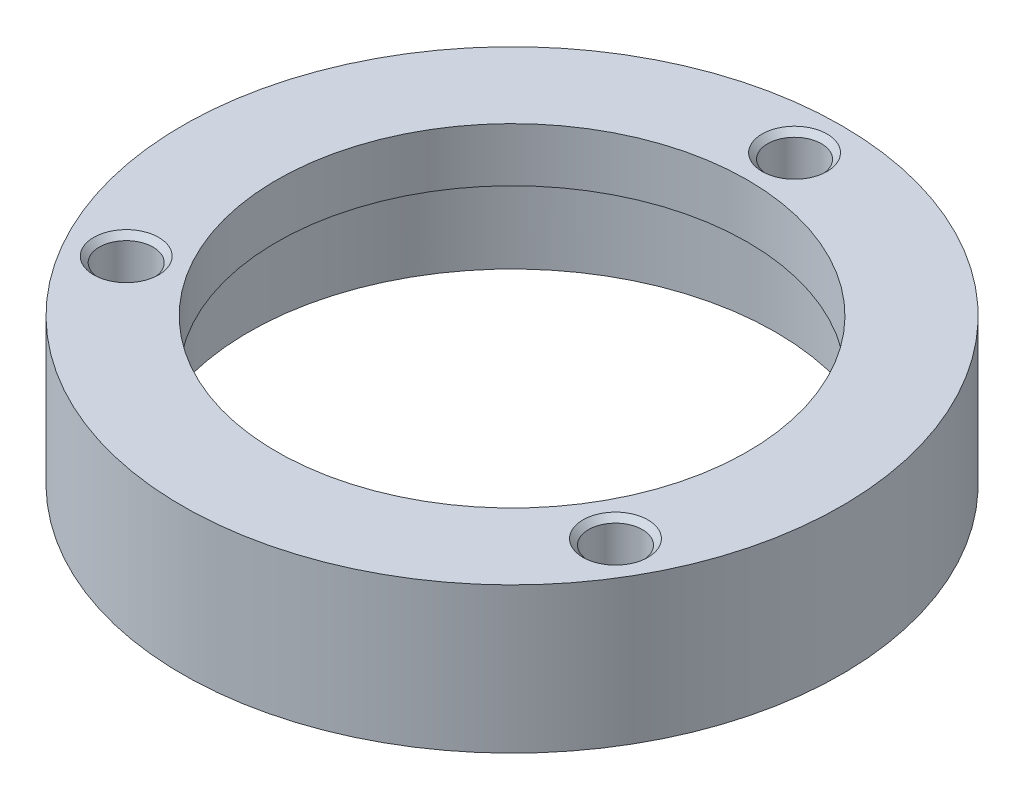
ISO-10303-21;
HEADER;
FILE_DESCRIPTION(('STEP AP214'),'2;1');
FILE_NAME('part.step','',(''),(''),'','','');
FILE_SCHEMA(('AUTOMOTIVE_DESIGN { 1 0 10303 214 1 1 1 1 }'));
ENDSEC;
DATA;
#1=APPLICATION_CONTEXT('core data for automotive mechanical design processes');
#2=APPLICATION_PROTOCOL_DEFINITION('international standard','automotive_design',2000,#1);
#3=PRODUCT_CONTEXT('',#1,'mechanical');
#4=PRODUCT('Part','Part','',(#3));
#5=PRODUCT_RELATED_PRODUCT_CATEGORY('part','',(#4));
#6=PRODUCT_DEFINITION_FORMATION('','',#4);
#7=PRODUCT_DEFINITION_CONTEXT('part definition',#1,'design');
#8=PRODUCT_DEFINITION('design','',#6,#7);
#9=PRODUCT_DEFINITION_SHAPE('','',#8);
#10=(LENGTH_UNIT() NAMED_UNIT(*) SI_UNIT(.MILLI.,.METRE.));
#11=(NAMED_UNIT(*) PLANE_ANGLE_UNIT() SI_UNIT($,.RADIAN.));
#12=(NAMED_UNIT(*) SI_UNIT($,.STERADIAN.) SOLID_ANGLE_UNIT());
#13=UNCERTAINTY_MEASURE_WITH_UNIT(LENGTH_MEASURE(1.E-05),#10,'distance_accuracy_value','');
#14=(GEOMETRIC_REPRESENTATION_CONTEXT(3) GLOBAL_UNCERTAINTY_ASSIGNED_CONTEXT((#13)) GLOBAL_UNIT_ASSIGNED_CONTEXT((#10,
#11,#12)) REPRESENTATION_CONTEXT('',''));
#15=CARTESIAN_POINT('',(0.,0.,0.));
#16=DIRECTION('',(0.,0.,1.));
#17=DIRECTION('',(1.,0.,0.));
#18=AXIS2_PLACEMENT_3D('',#15,#16,#17);
#19=CARTESIAN_POINT('',(0.,13.,0.));
#20=DIRECTION('',(0.,1.,0.));
#21=DIRECTION('',(0.,0.,1.));
#22=AXIS2_PLACEMENT_3D('',#19,#20,#21);
#23=PLANE('',#22);
#24=CARTESIAN_POINT('',(-21.8238401753679,13.,12.6));
#25=DIRECTION('',(0.,1.,0.));
#26=DIRECTION('',(0.,0.,1.));
#27=AXIS2_PLACEMENT_3D('',#24,#25,#26);
#28=CIRCLE('',#27,2.90000000000001);
#29=CARTESIAN_POINT('',(-21.8238401753679,13.,15.5));
#30=VERTEX_POINT('',#29);
#31=EDGE_CURVE('E62',#30,#30,#28,.F.);
#32=ORIENTED_EDGE('',*,*,#31,.T.);
#33=EDGE_LOOP('',(#32));
#34=FACE_BOUND('',#33,.T.);
#35=CARTESIAN_POINT('',(21.8238401753679,13.,12.6));
#36=DIRECTION('',(0.,1.,0.));
#37=DIRECTION('',(0.,0.,1.));
#38=AXIS2_PLACEMENT_3D('',#35,#36,#37);
#39=CIRCLE('',#38,2.90000000000012);
#40=CARTESIAN_POINT('',(21.8238401753679,13.,15.5000000000001));
#41=VERTEX_POINT('',#40);
#42=EDGE_CURVE('E68',#41,#41,#39,.F.);
#43=ORIENTED_EDGE('',*,*,#42,.T.);
#44=EDGE_LOOP('',(#43));
#45=FACE_BOUND('',#44,.T.);
#46=CARTESIAN_POINT('',(0.,13.,-25.2));
#47=DIRECTION('',(0.,1.,0.));
#48=DIRECTION('',(0.,0.,1.));
#49=AXIS2_PLACEMENT_3D('',#46,#47,#48);
#50=CIRCLE('',#49,2.90000000000001);
#51=CARTESIAN_POINT('',(0.,13.,-22.3));
#52=VERTEX_POINT('',#51);
#53=EDGE_CURVE('E72',#52,#52,#50,.F.);
#54=ORIENTED_EDGE('',*,*,#53,.T.);
#55=EDGE_LOOP('',(#54));
#56=FACE_BOUND('',#55,.T.);
#57=CARTESIAN_POINT('',(0.,13.,0.));
#58=DIRECTION('',(0.,1.,0.));
#59=DIRECTION('',(0.,0.,1.));
#60=AXIS2_PLACEMENT_3D('',#57,#58,#59);
#61=CIRCLE('',#60,29.4);
#62=CARTESIAN_POINT('',(0.,13.,-29.4));
#63=VERTEX_POINT('',#62);
#64=EDGE_CURVE('E80',#63,#63,#61,.T.);
#65=ORIENTED_EDGE('',*,*,#64,.T.);
#66=EDGE_LOOP('',(#65));
#67=FACE_BOUND('',#66,.T.);
#68=CARTESIAN_POINT('',(0.,13.,0.));
#69=DIRECTION('',(0.,1.,0.));
#70=DIRECTION('',(0.,0.,1.));
#71=AXIS2_PLACEMENT_3D('',#68,#69,#70);
#72=CIRCLE('',#71,21.);
#73=CARTESIAN_POINT('',(0.,13.,-21.));
#74=VERTEX_POINT('',#73);
#75=EDGE_CURVE('E85',#74,#74,#72,.T.);
#76=ORIENTED_EDGE('',*,*,#75,.F.);
#77=EDGE_LOOP('',(#76));
#78=FACE_BOUND('',#77,.T.);
#79=ADVANCED_FACE('F47',(#34,#45,#56,#67,#78),#23,.T.);
#80=CARTESIAN_POINT('',(0.,0.,0.));
#81=DIRECTION('',(0.,1.,0.));
#82=DIRECTION('',(0.,0.,1.));
#83=AXIS2_PLACEMENT_3D('',#80,#81,#82);
#84=PLANE('',#83);
#85=CARTESIAN_POINT('',(0.,0.,0.));
#86=DIRECTION('',(0.,-1.,0.));
#87=DIRECTION('',(0.,0.,-1.));
#88=AXIS2_PLACEMENT_3D('',#85,#86,#87);
#89=CIRCLE('',#88,23.5);
#90=CARTESIAN_POINT('',(0.,0.,-23.5));
#91=VERTEX_POINT('',#90);
#92=EDGE_CURVE('E108',#91,#91,#89,.T.);
#93=ORIENTED_EDGE('',*,*,#92,.F.);
#94=EDGE_LOOP('',(#93));
#95=FACE_BOUND('',#94,.T.);
#96=CARTESIAN_POINT('',(0.,0.,0.));
#97=DIRECTION('',(0.,1.,0.));
#98=DIRECTION('',(0.,0.,1.));
#99=AXIS2_PLACEMENT_3D('',#96,#97,#98);
#100=CIRCLE('',#99,29.4);
#101=CARTESIAN_POINT('',(0.,0.,-29.4));
#102=VERTEX_POINT('',#101);
#103=EDGE_CURVE('E81',#102,#102,#100,.T.);
#104=ORIENTED_EDGE('',*,*,#103,.F.);
#105=EDGE_LOOP('',(#104));
#106=FACE_BOUND('',#105,.T.);
#107=ADVANCED_FACE('F116',(#95,#106),#84,.F.);
#108=CARTESIAN_POINT('',(0.,13.,0.));
#109=DIRECTION('',(0.,-1.,0.));
#110=DIRECTION('',(0.,0.,-1.));
#111=AXIS2_PLACEMENT_3D('',#108,#109,#110);
#112=CYLINDRICAL_SURFACE('',#111,29.4);
#113=CARTESIAN_POINT('',(0.,13.,-29.4));
#114=CARTESIAN_POINT('',(0.,12.8645833333333,-29.4));
#115=CARTESIAN_POINT('',(0.,12.7291666666667,-29.4));
#116=CARTESIAN_POINT('',(0.,12.4583333333333,-29.4));
#117=CARTESIAN_POINT('',(0.,12.3229166666667,-29.4));
#118=CARTESIAN_POINT('',(0.,12.0520833333333,-29.4));
#119=CARTESIAN_POINT('',(0.,11.9166666666667,-29.4));
#120=CARTESIAN_POINT('',(0.,11.6458333333333,-29.4));
#121=CARTESIAN_POINT('',(0.,11.5104166666667,-29.4));
#122=CARTESIAN_POINT('',(0.,11.2395833333333,-29.4));
#123=CARTESIAN_POINT('',(0.,11.1041666666667,-29.4));
#124=CARTESIAN_POINT('',(0.,10.8333333333333,-29.4));
#125=CARTESIAN_POINT('',(0.,10.6979166666667,-29.4));
#126=CARTESIAN_POINT('',(0.,10.4270833333333,-29.4));
#127=CARTESIAN_POINT('',(0.,10.2916666666667,-29.4));
#128=CARTESIAN_POINT('',(0.,10.0208333333333,-29.4));
#129=CARTESIAN_POINT('',(0.,9.88541666666667,-29.4));
#130=CARTESIAN_POINT('',(0.,9.61458333333333,-29.4));
#131=CARTESIAN_POINT('',(0.,9.47916666666667,-29.4));
#132=CARTESIAN_POINT('',(0.,9.20833333333333,-29.4));
#133=CARTESIAN_POINT('',(0.,9.07291666666667,-29.4));
#134=CARTESIAN_POINT('',(0.,8.80208333333333,-29.4));
#135=CARTESIAN_POINT('',(0.,8.66666666666667,-29.4));
#136=CARTESIAN_POINT('',(0.,8.39583333333333,-29.4));
#137=CARTESIAN_POINT('',(0.,8.26041666666667,-29.4));
#138=CARTESIAN_POINT('',(0.,7.98958333333333,-29.4));
#139=CARTESIAN_POINT('',(0.,7.85416666666667,-29.4));
#140=CARTESIAN_POINT('',(0.,7.58333333333333,-29.4));
#141=CARTESIAN_POINT('',(0.,7.44791666666667,-29.4));
#142=CARTESIAN_POINT('',(0.,7.17708333333333,-29.4));
#143=CARTESIAN_POINT('',(0.,7.04166666666667,-29.4));
#144=CARTESIAN_POINT('',(0.,6.77083333333333,-29.4));
#145=CARTESIAN_POINT('',(0.,6.63541666666667,-29.4));
#146=CARTESIAN_POINT('',(0.,6.36458333333333,-29.4));
#147=CARTESIAN_POINT('',(0.,6.22916666666667,-29.4));
#148=CARTESIAN_POINT('',(0.,5.95833333333333,-29.4));
#149=CARTESIAN_POINT('',(0.,5.82291666666667,-29.4));
#150=CARTESIAN_POINT('',(0.,5.55208333333333,-29.4));
#151=CARTESIAN_POINT('',(0.,5.41666666666667,-29.4));
#152=CARTESIAN_POINT('',(0.,5.14583333333333,-29.4));
#153=CARTESIAN_POINT('',(0.,5.01041666666667,-29.4));
#154=CARTESIAN_POINT('',(0.,4.73958333333333,-29.4));
#155=CARTESIAN_POINT('',(0.,4.60416666666667,-29.4));
#156=CARTESIAN_POINT('',(0.,4.33333333333333,-29.4));
#157=CARTESIAN_POINT('',(0.,4.19791666666667,-29.4));
#158=CARTESIAN_POINT('',(0.,3.92708333333333,-29.4));
#159=CARTESIAN_POINT('',(0.,3.79166666666667,-29.4));
#160=CARTESIAN_POINT('',(0.,3.52083333333333,-29.4));
#161=CARTESIAN_POINT('',(0.,3.38541666666667,-29.4));
#162=CARTESIAN_POINT('',(0.,3.11458333333333,-29.4));
#163=CARTESIAN_POINT('',(0.,2.97916666666667,-29.4));
#164=CARTESIAN_POINT('',(0.,2.70833333333333,-29.4));
#165=CARTESIAN_POINT('',(0.,2.57291666666667,-29.4));
#166=CARTESIAN_POINT('',(0.,2.30208333333333,-29.4));
#167=CARTESIAN_POINT('',(0.,2.16666666666667,-29.4));
#168=CARTESIAN_POINT('',(0.,1.89583333333333,-29.4));
#169=CARTESIAN_POINT('',(0.,1.76041666666667,-29.4));
#170=CARTESIAN_POINT('',(0.,1.48958333333333,-29.4));
#171=CARTESIAN_POINT('',(0.,1.35416666666667,-29.4));
#172=CARTESIAN_POINT('',(0.,1.08333333333333,-29.4));
#173=CARTESIAN_POINT('',(0.,0.947916666666667,-29.4));
#174=CARTESIAN_POINT('',(0.,0.677083333333334,-29.4));
#175=CARTESIAN_POINT('',(0.,0.541666666666667,-29.4));
#176=CARTESIAN_POINT('',(0.,0.270833333333334,-29.4));
#177=CARTESIAN_POINT('',(0.,0.135416666666667,-29.4));
#178=CARTESIAN_POINT('',(0.,0.,-29.4));
#179=B_SPLINE_CURVE_WITH_KNOTS('',3,(#113,#114,#115,#116,#117,#118,#119,#120,#121,#122,#123,
#124,#125,#126,#127,#128,#129,#130,#131,#132,#133,#134,#135,#136,#137,#138,#139,#140,#141,#142,
#143,#144,#145,#146,#147,#148,#149,#150,#151,#152,#153,#154,#155,#156,#157,#158,#159,#160,#161,
#162,#163,#164,#165,#166,#167,#168,#169,#170,#171,#172,#173,#174,#175,#176,#177,#178),
.UNSPECIFIED.,.F.,.F.,(4,2,2,2,2,2,2,2,2,2,2,2,2,2,2,2,2,2,2,2,2,2,2,2,2,2,2,2,2,2,2,2,4),(0.,
0.406249999999999,0.812499999999999,1.21875,1.625,2.03125,2.4375,2.84375,3.25,3.65625,4.0625,
4.46875,4.875,5.28125,5.6875,6.09375,6.5,6.90625,7.3125,7.71875,8.125,8.53125,8.9375,9.34375,
9.75,10.15625,10.5625,10.96875,11.375,11.78125,12.1875,12.59375,13.),.UNSPECIFIED.);
#180=EDGE_CURVE('BSEAM119',#63,#102,#179,.T.);
#181=ORIENTED_EDGE('',*,*,#64,.F.);
#182=ORIENTED_EDGE('',*,*,#103,.T.);
#183=ORIENTED_EDGE('',*,*,#180,.T.);
#184=ORIENTED_EDGE('',*,*,#180,.F.);
#185=EDGE_LOOP('',(#181,#183,#182,#184));
#186=FACE_BOUND('',#185,.T.);
#187=ADVANCED_FACE('F119',(#186),#112,.T.);
#188=CARTESIAN_POINT('',(0.,13.,0.));
#189=DIRECTION('',(0.,-1.,0.));
#190=DIRECTION('',(0.,0.,-1.));
#191=AXIS2_PLACEMENT_3D('',#188,#189,#190);
#192=CYLINDRICAL_SURFACE('',#191,21.);
#193=CARTESIAN_POINT('',(0.,8.2,0.));
#194=DIRECTION('',(0.,1.,0.));
#195=DIRECTION('',(0.,0.,1.));
#196=AXIS2_PLACEMENT_3D('',#193,#194,#195);
#197=CIRCLE('',#196,21.);
#198=CARTESIAN_POINT('',(0.,8.2,-21.));
#199=VERTEX_POINT('',#198);
#200=EDGE_CURVE('E52',#199,#199,#197,.T.);
#201=CARTESIAN_POINT('',(0.,8.2,-21.));
#202=CARTESIAN_POINT('',(0.,8.25,-21.));
#203=CARTESIAN_POINT('',(0.,8.3,-21.));
#204=CARTESIAN_POINT('',(0.,8.4,-21.));
#205=CARTESIAN_POINT('',(0.,8.45,-21.));
#206=CARTESIAN_POINT('',(0.,8.55,-21.));
#207=CARTESIAN_POINT('',(0.,8.6,-21.));
#208=CARTESIAN_POINT('',(0.,8.7,-21.));
#209=CARTESIAN_POINT('',(0.,8.75,-21.));
#210=CARTESIAN_POINT('',(0.,8.85,-21.));
#211=CARTESIAN_POINT('',(0.,8.9,-21.));
#212=CARTESIAN_POINT('',(0.,9.,-21.));
#213=CARTESIAN_POINT('',(0.,9.05,-21.));
#214=CARTESIAN_POINT('',(0.,9.15,-21.));
#215=CARTESIAN_POINT('',(0.,9.2,-21.));
#216=CARTESIAN_POINT('',(0.,9.3,-21.));
#217=CARTESIAN_POINT('',(0.,9.35,-21.));
#218=CARTESIAN_POINT('',(0.,9.45,-21.));
#219=CARTESIAN_POINT('',(0.,9.5,-21.));
#220=CARTESIAN_POINT('',(0.,9.6,-21.));
#221=CARTESIAN_POINT('',(0.,9.65,-21.));
#222=CARTESIAN_POINT('',(0.,9.75,-21.));
#223=CARTESIAN_POINT('',(0.,9.8,-21.));
#224=CARTESIAN_POINT('',(0.,9.9,-21.));
#225=CARTESIAN_POINT('',(0.,9.95,-21.));
#226=CARTESIAN_POINT('',(0.,10.05,-21.));
#227=CARTESIAN_POINT('',(0.,10.1,-21.));
#228=CARTESIAN_POINT('',(0.,10.2,-21.));
#229=CARTESIAN_POINT('',(0.,10.25,-21.));
#230=CARTESIAN_POINT('',(0.,10.35,-21.));
#231=CARTESIAN_POINT('',(0.,10.4,-21.));
#232=CARTESIAN_POINT('',(0.,10.5,-21.));
#233=CARTESIAN_POINT('',(0.,10.55,-21.));
#234=CARTESIAN_POINT('',(0.,10.65,-21.));
#235=CARTESIAN_POINT('',(0.,10.7,-21.));
#236=CARTESIAN_POINT('',(0.,10.8,-21.));
#237=CARTESIAN_POINT('',(0.,10.85,-21.));
#238=CARTESIAN_POINT('',(0.,10.95,-21.));
#239=CARTESIAN_POINT('',(0.,11.,-21.));
#240=CARTESIAN_POINT('',(0.,11.1,-21.));
#241=CARTESIAN_POINT('',(0.,11.15,-21.));
#242=CARTESIAN_POINT('',(0.,11.25,-21.));
#243=CARTESIAN_POINT('',(0.,11.3,-21.));
#244=CARTESIAN_POINT('',(0.,11.4,-21.));
#245=CARTESIAN_POINT('',(0.,11.45,-21.));
#246=CARTESIAN_POINT('',(0.,11.55,-21.));
#247=CARTESIAN_POINT('',(0.,11.6,-21.));
#248=CARTESIAN_POINT('',(0.,11.7,-21.));
#249=CARTESIAN_POINT('',(0.,11.75,-21.));
#250=CARTESIAN_POINT('',(0.,11.85,-21.));
#251=CARTESIAN_POINT('',(0.,11.9,-21.));
#252=CARTESIAN_POINT('',(0.,12.,-21.));
#253=CARTESIAN_POINT('',(0.,12.05,-21.));
#254=CARTESIAN_POINT('',(0.,12.15,-21.));
#255=CARTESIAN_POINT('',(0.,12.2,-21.));
#256=CARTESIAN_POINT('',(0.,12.3,-21.));
#257=CARTESIAN_POINT('',(0.,12.35,-21.));
#258=CARTESIAN_POINT('',(0.,12.45,-21.));
#259=CARTESIAN_POINT('',(0.,12.5,-21.));
#260=CARTESIAN_POINT('',(0.,12.6,-21.));
#261=CARTESIAN_POINT('',(0.,12.65,-21.));
#262=CARTESIAN_POINT('',(0.,12.75,-21.));
#263=CARTESIAN_POINT('',(0.,12.8,-21.));
#264=CARTESIAN_POINT('',(0.,12.9,-21.));
#265=CARTESIAN_POINT('',(0.,12.95,-21.));
#266=CARTESIAN_POINT('',(0.,13.,-21.));
#267=B_SPLINE_CURVE_WITH_KNOTS('',3,(#201,#202,#203,#204,#205,#206,#207,#208,#209,#210,#211,
#212,#213,#214,#215,#216,#217,#218,#219,#220,#221,#222,#223,#224,#225,#226,#227,#228,#229,#230,
#231,#232,#233,#234,#235,#236,#237,#238,#239,#240,#241,#242,#243,#244,#245,#246,#247,#248,#249,
#250,#251,#252,#253,#254,#255,#256,#257,#258,#259,#260,#261,#262,#263,#264,#265,#266),
.UNSPECIFIED.,.F.,.F.,(4,2,2,2,2,2,2,2,2,2,2,2,2,2,2,2,2,2,2,2,2,2,2,2,2,2,2,2,2,2,2,2,4),(0.,
0.149999999999999,0.299999999999998,0.449999999999999,0.6,0.750000000000001,0.899999999999998,
1.05,1.2,1.35,1.5,1.65,1.8,1.95,2.1,2.25,2.4,2.55,2.7,2.85,3.,3.15,3.3,3.45,3.6,3.75,3.9,4.05,
4.2,4.35,4.5,4.65,4.8),.UNSPECIFIED.);
#268=EDGE_CURVE('BSEAM124',#199,#74,#267,.T.);
#269=ORIENTED_EDGE('',*,*,#200,.F.);
#270=ORIENTED_EDGE('',*,*,#75,.T.);
#271=ORIENTED_EDGE('',*,*,#268,.T.);
#272=ORIENTED_EDGE('',*,*,#268,.F.);
#273=EDGE_LOOP('',(#269,#271,#270,#272));
#274=FACE_BOUND('',#273,.T.);
#275=ADVANCED_FACE('F124',(#274),#192,.F.);
#276=CARTESIAN_POINT('',(-21.8238401753679,9.,12.6));
#277=DIRECTION('',(0.,1.,0.));
#278=DIRECTION('',(0.,0.,1.));
#279=AXIS2_PLACEMENT_3D('',#276,#277,#278);
#280=CYLINDRICAL_SURFACE('',#279,2.4);
#281=CARTESIAN_POINT('',(-21.8238401753679,12.5,12.6));
#282=DIRECTION('',(0.,1.,0.));
#283=DIRECTION('',(0.,0.,1.));
#284=AXIS2_PLACEMENT_3D('',#281,#282,#283);
#285=CIRCLE('',#284,2.4);
#286=CARTESIAN_POINT('',(-21.8238401753679,12.5,15.));
#287=VERTEX_POINT('',#286);
#288=EDGE_CURVE('E76',#287,#287,#285,.T.);
#289=ORIENTED_EDGE('',*,*,#288,.T.);
#290=EDGE_LOOP('',(#289));
#291=FACE_BOUND('',#290,.T.);
#292=CARTESIAN_POINT('',(-21.8238401753679,9.,12.6));
#293=DIRECTION('',(0.,1.,0.));
#294=DIRECTION('',(0.,0.,1.));
#295=AXIS2_PLACEMENT_3D('',#292,#293,#294);
#296=CIRCLE('',#295,2.4);
#297=CARTESIAN_POINT('',(-21.8238401753679,9.,15.));
#298=VERTEX_POINT('',#297);
#299=EDGE_CURVE('E93',#298,#298,#296,.T.);
#300=ORIENTED_EDGE('',*,*,#299,.F.);
#301=EDGE_LOOP('',(#300));
#302=FACE_BOUND('',#301,.T.);
#303=ADVANCED_FACE('F131',(#291,#302),#280,.F.);
#304=CARTESIAN_POINT('',(-21.8238401753679,9.,12.6));
#305=DIRECTION('',(0.,1.,0.));
#306=DIRECTION('',(0.,0.,1.));
#307=AXIS2_PLACEMENT_3D('',#304,#305,#306);
#308=PLANE('',#307);
#309=ORIENTED_EDGE('',*,*,#299,.T.);
#310=EDGE_LOOP('',(#309));
#311=FACE_BOUND('',#310,.T.);
#312=ADVANCED_FACE('F145',(#311),#308,.T.);
#313=CARTESIAN_POINT('',(21.8238401753679,9.,12.6));
#314=DIRECTION('',(0.,1.,0.));
#315=DIRECTION('',(0.,0.,1.));
#316=AXIS2_PLACEMENT_3D('',#313,#314,#315);
#317=CYLINDRICAL_SURFACE('',#316,2.40000000000012);
#318=CARTESIAN_POINT('',(21.8238401753679,12.5,12.6));
#319=DIRECTION('',(0.,1.,0.));
#320=DIRECTION('',(0.,0.,1.));
#321=AXIS2_PLACEMENT_3D('',#318,#319,#320);
#322=CIRCLE('',#321,2.40000000000012);
#323=CARTESIAN_POINT('',(21.8238401753679,12.5,15.0000000000001));
#324=VERTEX_POINT('',#323);
#325=EDGE_CURVE('E57',#324,#324,#322,.T.);
#326=ORIENTED_EDGE('',*,*,#325,.T.);
#327=EDGE_LOOP('',(#326));
#328=FACE_BOUND('',#327,.T.);
#329=CARTESIAN_POINT('',(21.8238401753679,9.,12.6));
#330=DIRECTION('',(0.,1.,0.));
#331=DIRECTION('',(0.,0.,1.));
#332=AXIS2_PLACEMENT_3D('',#329,#330,#331);
#333=CIRCLE('',#332,2.40000000000012);
#334=CARTESIAN_POINT('',(21.8238401753679,9.,15.0000000000001));
#335=VERTEX_POINT('',#334);
#336=EDGE_CURVE('E97',#335,#335,#333,.T.);
#337=ORIENTED_EDGE('',*,*,#336,.F.);
#338=EDGE_LOOP('',(#337));
#339=FACE_BOUND('',#338,.T.);
#340=ADVANCED_FACE('F147',(#328,#339),#317,.F.);
#341=CARTESIAN_POINT('',(21.8238401753679,9.,12.6));
#342=DIRECTION('',(0.,1.,0.));
#343=DIRECTION('',(0.,0.,1.));
#344=AXIS2_PLACEMENT_3D('',#341,#342,#343);
#345=PLANE('',#344);
#346=ORIENTED_EDGE('',*,*,#336,.T.);
#347=EDGE_LOOP('',(#346));
#348=FACE_BOUND('',#347,.T.);
#349=ADVANCED_FACE('F151',(#348),#345,.T.);
#350=CARTESIAN_POINT('',(0.,9.,-25.2));
#351=DIRECTION('',(0.,1.,0.));
#352=DIRECTION('',(0.,0.,1.));
#353=AXIS2_PLACEMENT_3D('',#350,#351,#352);
#354=CYLINDRICAL_SURFACE('',#353,2.4);
#355=CARTESIAN_POINT('',(0.,12.5,-25.2));
#356=DIRECTION('',(0.,1.,0.));
#357=DIRECTION('',(0.,0.,1.));
#358=AXIS2_PLACEMENT_3D('',#355,#356,#357);
#359=CIRCLE('',#358,2.4);
#360=CARTESIAN_POINT('',(0.,12.5,-22.8));
#361=VERTEX_POINT('',#360);
#362=EDGE_CURVE('E11',#361,#361,#359,.T.);
#363=ORIENTED_EDGE('',*,*,#362,.T.);
#364=EDGE_LOOP('',(#363));
#365=FACE_BOUND('',#364,.T.);
#366=CARTESIAN_POINT('',(0.,9.,-25.2));
#367=DIRECTION('',(0.,1.,0.));
#368=DIRECTION('',(0.,0.,1.));
#369=AXIS2_PLACEMENT_3D('',#366,#367,#368);
#370=CIRCLE('',#369,2.4);
#371=CARTESIAN_POINT('',(0.,9.,-22.8));
#372=VERTEX_POINT('',#371);
#373=EDGE_CURVE('E92',#372,#372,#370,.T.);
#374=ORIENTED_EDGE('',*,*,#373,.F.);
#375=EDGE_LOOP('',(#374));
#376=FACE_BOUND('',#375,.T.);
#377=ADVANCED_FACE('F154',(#365,#376),#354,.F.);
#378=CARTESIAN_POINT('',(0.,9.,-25.2));
#379=DIRECTION('',(0.,1.,0.));
#380=DIRECTION('',(0.,0.,1.));
#381=AXIS2_PLACEMENT_3D('',#378,#379,#380);
#382=PLANE('',#381);
#383=ORIENTED_EDGE('',*,*,#373,.T.);
#384=EDGE_LOOP('',(#383));
#385=FACE_BOUND('',#384,.T.);
#386=ADVANCED_FACE('F161',(#385),#382,.T.);
#387=CARTESIAN_POINT('',(-21.8238401753679,12.5,12.6));
#388=DIRECTION('',(0.,1.,0.));
#389=DIRECTION('',(0.,0.,1.));
#390=AXIS2_PLACEMENT_3D('',#387,#388,#389);
#391=CONICAL_SURFACE('',#390,2.4,0.785398163397447);
#392=ORIENTED_EDGE('',*,*,#31,.F.);
#393=EDGE_LOOP('',(#392));
#394=FACE_BOUND('',#393,.T.);
#395=ORIENTED_EDGE('',*,*,#288,.F.);
#396=EDGE_LOOP('',(#395));
#397=FACE_BOUND('',#396,.T.);
#398=ADVANCED_FACE('F163',(#394,#397),#391,.F.);
#399=CARTESIAN_POINT('',(21.8238401753679,12.5,12.6));
#400=DIRECTION('',(0.,1.,0.));
#401=DIRECTION('',(0.,0.,1.));
#402=AXIS2_PLACEMENT_3D('',#399,#400,#401);
#403=CONICAL_SURFACE('',#402,2.40000000000012,0.785398163397447);
#404=ORIENTED_EDGE('',*,*,#42,.F.);
#405=EDGE_LOOP('',(#404));
#406=FACE_BOUND('',#405,.T.);
#407=ORIENTED_EDGE('',*,*,#325,.F.);
#408=EDGE_LOOP('',(#407));
#409=FACE_BOUND('',#408,.T.);
#410=ADVANCED_FACE('F195',(#406,#409),#403,.F.);
#411=CARTESIAN_POINT('',(0.,12.5,-25.2));
#412=DIRECTION('',(0.,1.,0.));
#413=DIRECTION('',(0.,0.,1.));
#414=AXIS2_PLACEMENT_3D('',#411,#412,#413);
#415=CONICAL_SURFACE('',#414,2.4,0.785398163397448);
#416=ORIENTED_EDGE('',*,*,#53,.F.);
#417=EDGE_LOOP('',(#416));
#418=FACE_BOUND('',#417,.T.);
#419=ORIENTED_EDGE('',*,*,#362,.F.);
#420=EDGE_LOOP('',(#419));
#421=FACE_BOUND('',#420,.T.);
#422=ADVANCED_FACE('F50',(#418,#421),#415,.F.);
#423=CARTESIAN_POINT('',(0.,8.2,0.));
#424=DIRECTION('',(0.,1.,0.));
#425=DIRECTION('',(0.,0.,1.));
#426=AXIS2_PLACEMENT_3D('',#423,#424,#425);
#427=PLANE('',#426);
#428=ORIENTED_EDGE('',*,*,#200,.T.);
#429=EDGE_LOOP('',(#428));
#430=FACE_BOUND('',#429,.T.);
#431=CARTESIAN_POINT('',(0.,8.2,0.));
#432=DIRECTION('',(0.,1.,0.));
#433=DIRECTION('',(0.,0.,1.));
#434=AXIS2_PLACEMENT_3D('',#431,#432,#433);
#435=CIRCLE('',#434,23.5);
#436=CARTESIAN_POINT('',(0.,8.2,23.5));
#437=VERTEX_POINT('',#436);
#438=EDGE_CURVE('E104',#437,#437,#435,.F.);
#439=ORIENTED_EDGE('',*,*,#438,.T.);
#440=EDGE_LOOP('',(#439));
#441=FACE_BOUND('',#440,.T.);
#442=ADVANCED_FACE('F165',(#430,#441),#427,.F.);
#443=CARTESIAN_POINT('',(0.,79.4680374315355,0.));
#444=DIRECTION('',(0.,-1.,0.));
#445=DIRECTION('',(0.,0.,-1.));
#446=AXIS2_PLACEMENT_3D('',#443,#444,#445);
#447=CYLINDRICAL_SURFACE('',#446,23.5);
#448=ORIENTED_EDGE('',*,*,#92,.T.);
#449=EDGE_LOOP('',(#448));
#450=FACE_BOUND('',#449,.T.);
#451=ORIENTED_EDGE('',*,*,#438,.F.);
#452=EDGE_LOOP('',(#451));
#453=FACE_BOUND('',#452,.T.);
#454=ADVANCED_FACE('F113',(#450,#453),#447,.F.);
#455=CLOSED_SHELL('',(#79,#107,#187,#275,#303,#312,#340,#349,#377,#386,#398,#410,#422,#442,#454));
#456=MANIFOLD_SOLID_BREP('B2',#455);
#457=ADVANCED_BREP_SHAPE_REPRESENTATION('',(#18,#456),#14);
#458=SHAPE_DEFINITION_REPRESENTATION(#9,#457);
ENDSEC;
END-ISO-10303-21;
